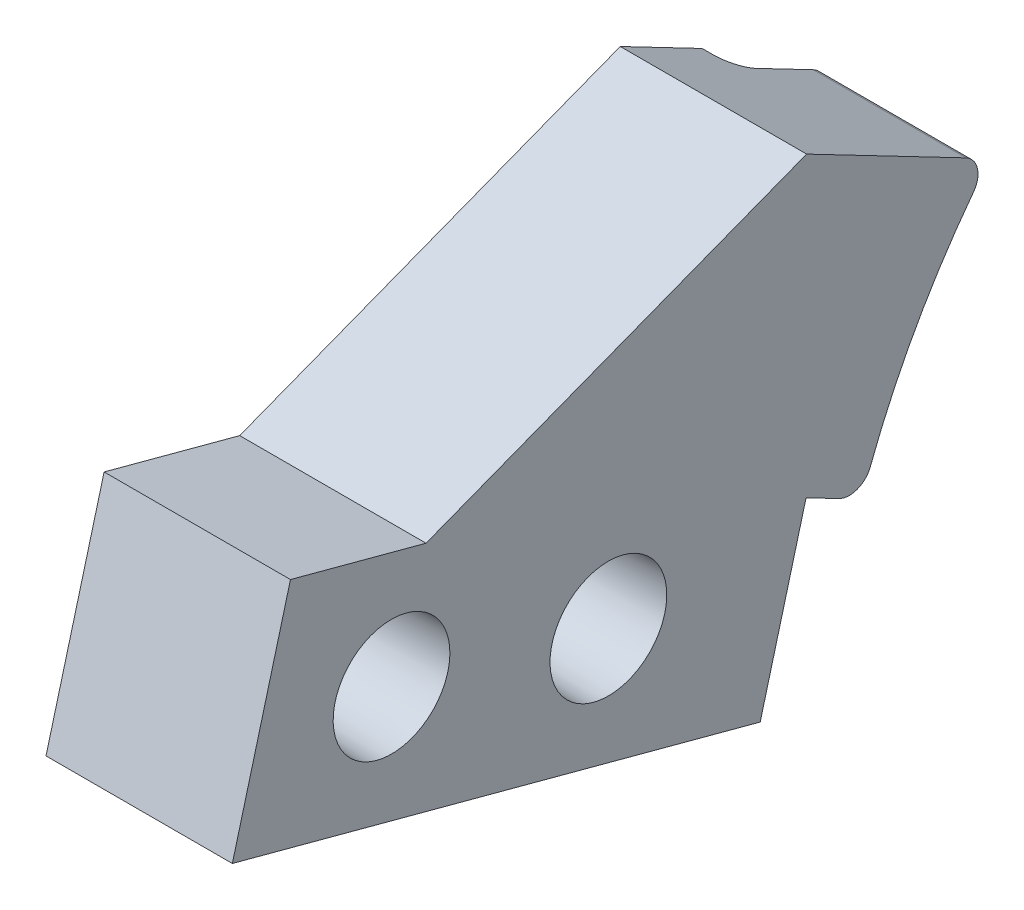
ISO-10303-21;
HEADER;
FILE_DESCRIPTION(('STEP AP214'),'2;1');
FILE_NAME('part.step','',(''),(''),'','','');
FILE_SCHEMA(('AUTOMOTIVE_DESIGN { 1 0 10303 214 1 1 1 1 }'));
ENDSEC;
DATA;
#1=APPLICATION_CONTEXT('core data for automotive mechanical design processes');
#2=APPLICATION_PROTOCOL_DEFINITION('international standard','automotive_design',2000,#1);
#3=PRODUCT_CONTEXT('',#1,'mechanical');
#4=PRODUCT('Part','Part','',(#3));
#5=PRODUCT_RELATED_PRODUCT_CATEGORY('part','',(#4));
#6=PRODUCT_DEFINITION_FORMATION('','',#4);
#7=PRODUCT_DEFINITION_CONTEXT('part definition',#1,'design');
#8=PRODUCT_DEFINITION('design','',#6,#7);
#9=PRODUCT_DEFINITION_SHAPE('','',#8);
#10=(LENGTH_UNIT() NAMED_UNIT(*) SI_UNIT(.MILLI.,.METRE.));
#11=(NAMED_UNIT(*) PLANE_ANGLE_UNIT() SI_UNIT($,.RADIAN.));
#12=(NAMED_UNIT(*) SI_UNIT($,.STERADIAN.) SOLID_ANGLE_UNIT());
#13=UNCERTAINTY_MEASURE_WITH_UNIT(LENGTH_MEASURE(1.E-05),#10,'distance_accuracy_value','');
#14=(GEOMETRIC_REPRESENTATION_CONTEXT(3) GLOBAL_UNCERTAINTY_ASSIGNED_CONTEXT((#13)) GLOBAL_UNIT_ASSIGNED_CONTEXT((#10,
#11,#12)) REPRESENTATION_CONTEXT('',''));
#15=CARTESIAN_POINT('',(0.,0.,0.));
#16=DIRECTION('',(0.,0.,1.));
#17=DIRECTION('',(1.,0.,0.));
#18=AXIS2_PLACEMENT_3D('',#15,#16,#17);
#19=CARTESIAN_POINT('',(22.530729083298,71.5143055066949,42.9719731648555));
#20=DIRECTION('',(-1.,0.,0.));
#21=DIRECTION('',(0.,-1.,0.));
#22=AXIS2_PLACEMENT_3D('',#19,#20,#21);
#23=CYLINDRICAL_SURFACE('',#22,1.7);
#24=CARTESIAN_POINT('',(-13.45,71.5143055066949,42.9719731648555));
#25=DIRECTION('',(1.,0.,0.));
#26=DIRECTION('',(0.,1.,0.));
#27=AXIS2_PLACEMENT_3D('',#24,#25,#26);
#28=CIRCLE('',#27,1.7);
#29=CARTESIAN_POINT('',(-13.45,69.8143055066949,42.9719731648555));
#30=VERTEX_POINT('',#29);
#31=EDGE_CURVE('E334',#30,#30,#28,.T.);
#32=CARTESIAN_POINT('',(-9.05,71.5143055066949,42.9719731648555));
#33=DIRECTION('',(1.,0.,0.));
#34=DIRECTION('',(0.,1.,0.));
#35=AXIS2_PLACEMENT_3D('',#32,#33,#34);
#36=CIRCLE('',#35,1.7);
#37=CARTESIAN_POINT('',(-9.05000000000001,69.8143055066949,42.9719731648555));
#38=VERTEX_POINT('',#37);
#39=EDGE_CURVE('E122',#38,#38,#36,.T.);
#40=CARTESIAN_POINT('',(-13.45,69.8143055066949,42.9719731648555));
#41=CARTESIAN_POINT('',(-13.4041666666667,69.8143055066949,42.9719731648555));
#42=CARTESIAN_POINT('',(-13.3583333333333,69.8143055066949,42.9719731648555));
#43=CARTESIAN_POINT('',(-13.2666666666667,69.8143055066949,42.9719731648555));
#44=CARTESIAN_POINT('',(-13.2208333333333,69.8143055066949,42.9719731648555));
#45=CARTESIAN_POINT('',(-13.1291666666667,69.8143055066949,42.9719731648555));
#46=CARTESIAN_POINT('',(-13.0833333333333,69.8143055066949,42.9719731648555));
#47=CARTESIAN_POINT('',(-12.9916666666667,69.8143055066949,42.9719731648555));
#48=CARTESIAN_POINT('',(-12.9458333333333,69.8143055066949,42.9719731648555));
#49=CARTESIAN_POINT('',(-12.8541666666667,69.8143055066949,42.9719731648555));
#50=CARTESIAN_POINT('',(-12.8083333333333,69.8143055066949,42.9719731648555));
#51=CARTESIAN_POINT('',(-12.7166666666667,69.8143055066949,42.9719731648555));
#52=CARTESIAN_POINT('',(-12.6708333333333,69.8143055066949,42.9719731648555));
#53=CARTESIAN_POINT('',(-12.5791666666667,69.8143055066949,42.9719731648555));
#54=CARTESIAN_POINT('',(-12.5333333333333,69.8143055066949,42.9719731648555));
#55=CARTESIAN_POINT('',(-12.4416666666667,69.8143055066949,42.9719731648555));
#56=CARTESIAN_POINT('',(-12.3958333333333,69.8143055066949,42.9719731648555));
#57=CARTESIAN_POINT('',(-12.3041666666667,69.8143055066949,42.9719731648555));
#58=CARTESIAN_POINT('',(-12.2583333333333,69.8143055066949,42.9719731648555));
#59=CARTESIAN_POINT('',(-12.1666666666667,69.8143055066949,42.9719731648555));
#60=CARTESIAN_POINT('',(-12.1208333333333,69.8143055066949,42.9719731648555));
#61=CARTESIAN_POINT('',(-12.0291666666667,69.8143055066949,42.9719731648555));
#62=CARTESIAN_POINT('',(-11.9833333333333,69.8143055066949,42.9719731648555));
#63=CARTESIAN_POINT('',(-11.8916666666667,69.8143055066949,42.9719731648555));
#64=CARTESIAN_POINT('',(-11.8458333333333,69.8143055066949,42.9719731648555));
#65=CARTESIAN_POINT('',(-11.7541666666667,69.8143055066949,42.9719731648555));
#66=CARTESIAN_POINT('',(-11.7083333333333,69.8143055066949,42.9719731648555));
#67=CARTESIAN_POINT('',(-11.6166666666667,69.8143055066949,42.9719731648555));
#68=CARTESIAN_POINT('',(-11.5708333333333,69.8143055066949,42.9719731648555));
#69=CARTESIAN_POINT('',(-11.4791666666667,69.8143055066949,42.9719731648555));
#70=CARTESIAN_POINT('',(-11.4333333333333,69.8143055066949,42.9719731648555));
#71=CARTESIAN_POINT('',(-11.3416666666667,69.8143055066949,42.9719731648555));
#72=CARTESIAN_POINT('',(-11.2958333333333,69.8143055066949,42.9719731648555));
#73=CARTESIAN_POINT('',(-11.2041666666667,69.8143055066949,42.9719731648555));
#74=CARTESIAN_POINT('',(-11.1583333333333,69.8143055066949,42.9719731648555));
#75=CARTESIAN_POINT('',(-11.0666666666667,69.8143055066949,42.9719731648555));
#76=CARTESIAN_POINT('',(-11.0208333333333,69.8143055066949,42.9719731648555));
#77=CARTESIAN_POINT('',(-10.9291666666667,69.8143055066949,42.9719731648555));
#78=CARTESIAN_POINT('',(-10.8833333333333,69.8143055066949,42.9719731648555));
#79=CARTESIAN_POINT('',(-10.7916666666667,69.8143055066949,42.9719731648555));
#80=CARTESIAN_POINT('',(-10.7458333333333,69.8143055066949,42.9719731648555));
#81=CARTESIAN_POINT('',(-10.6541666666667,69.8143055066949,42.9719731648555));
#82=CARTESIAN_POINT('',(-10.6083333333333,69.8143055066949,42.9719731648555));
#83=CARTESIAN_POINT('',(-10.5166666666667,69.8143055066949,42.9719731648555));
#84=CARTESIAN_POINT('',(-10.4708333333333,69.8143055066949,42.9719731648555));
#85=CARTESIAN_POINT('',(-10.3791666666667,69.8143055066949,42.9719731648555));
#86=CARTESIAN_POINT('',(-10.3333333333333,69.8143055066949,42.9719731648555));
#87=CARTESIAN_POINT('',(-10.2416666666667,69.8143055066949,42.9719731648555));
#88=CARTESIAN_POINT('',(-10.1958333333333,69.8143055066949,42.9719731648555));
#89=CARTESIAN_POINT('',(-10.1041666666667,69.8143055066949,42.9719731648555));
#90=CARTESIAN_POINT('',(-10.0583333333333,69.8143055066949,42.9719731648555));
#91=CARTESIAN_POINT('',(-9.96666666666667,69.8143055066949,42.9719731648555));
#92=CARTESIAN_POINT('',(-9.92083333333334,69.8143055066949,42.9719731648555));
#93=CARTESIAN_POINT('',(-9.82916666666667,69.8143055066949,42.9719731648555));
#94=CARTESIAN_POINT('',(-9.78333333333334,69.8143055066949,42.9719731648555));
#95=CARTESIAN_POINT('',(-9.69166666666668,69.8143055066949,42.9719731648555));
#96=CARTESIAN_POINT('',(-9.64583333333334,69.8143055066949,42.9719731648555));
#97=CARTESIAN_POINT('',(-9.55416666666667,69.8143055066949,42.9719731648555));
#98=CARTESIAN_POINT('',(-9.50833333333334,69.8143055066949,42.9719731648555));
#99=CARTESIAN_POINT('',(-9.41666666666667,69.8143055066949,42.9719731648555));
#100=CARTESIAN_POINT('',(-9.37083333333334,69.8143055066949,42.9719731648555));
#101=CARTESIAN_POINT('',(-9.27916666666667,69.8143055066949,42.9719731648555));
#102=CARTESIAN_POINT('',(-9.23333333333334,69.8143055066949,42.9719731648555));
#103=CARTESIAN_POINT('',(-9.14166666666667,69.8143055066949,42.9719731648555));
#104=CARTESIAN_POINT('',(-9.09583333333334,69.8143055066949,42.9719731648555));
#105=CARTESIAN_POINT('',(-9.05000000000001,69.8143055066949,42.9719731648555));
#106=B_SPLINE_CURVE_WITH_KNOTS('',3,(#40,#41,#42,#43,#44,#45,#46,#47,#48,#49,#50,#51,#52,#53,
#54,#55,#56,#57,#58,#59,#60,#61,#62,#63,#64,#65,#66,#67,#68,#69,#70,#71,#72,#73,#74,#75,#76,#77,
#78,#79,#80,#81,#82,#83,#84,#85,#86,#87,#88,#89,#90,#91,#92,#93,#94,#95,#96,#97,#98,#99,#100,
#101,#102,#103,#104,#105),.UNSPECIFIED.,.F.,.F.,(4,2,2,2,2,2,2,2,2,2,2,2,2,2,2,2,2,2,2,2,2,2,2,
2,2,2,2,2,2,2,2,2,4),(0.,0.137499999999999,0.274999999999997,0.412499999999996,
0.549999999999995,0.687500000000001,0.824999999999999,0.962499999999998,1.1,1.2375,
1.37499999999999,1.51249999999999,1.65,1.7875,1.925,2.06249999999999,2.19999999999999,
2.33749999999999,2.47499999999999,2.61249999999999,2.74999999999999,2.88749999999999,
3.02499999999999,3.16249999999999,3.29999999999999,3.43749999999999,3.57499999999999,
3.71249999999999,3.84999999999999,3.98749999999999,4.12499999999999,4.26249999999999,
4.39999999999999),.UNSPECIFIED.);
#107=EDGE_CURVE('BSEAM117',#30,#38,#106,.T.);
#108=ORIENTED_EDGE('',*,*,#31,.F.);
#109=ORIENTED_EDGE('',*,*,#39,.T.);
#110=ORIENTED_EDGE('',*,*,#107,.T.);
#111=ORIENTED_EDGE('',*,*,#107,.F.);
#112=EDGE_LOOP('',(#108,#110,#109,#111));
#113=FACE_BOUND('',#112,.T.);
#114=ADVANCED_FACE('F117',(#113),#23,.F.);
#115=CARTESIAN_POINT('',(22.530729083298,74.1024959577201,52.6312314277462));
#116=DIRECTION('',(-1.,0.,0.));
#117=DIRECTION('',(0.,-1.,0.));
#118=AXIS2_PLACEMENT_3D('',#115,#116,#117);
#119=CYLINDRICAL_SURFACE('',#118,1.70000000000049);
#120=CARTESIAN_POINT('',(-13.45,74.1024959577201,52.6312314277462));
#121=DIRECTION('',(1.,0.,0.));
#122=DIRECTION('',(0.,1.,0.));
#123=AXIS2_PLACEMENT_3D('',#120,#121,#122);
#124=CIRCLE('',#123,1.70000000000049);
#125=CARTESIAN_POINT('',(-13.45,72.4024959577197,52.6312314277462));
#126=VERTEX_POINT('',#125);
#127=EDGE_CURVE('E310',#126,#126,#124,.T.);
#128=CARTESIAN_POINT('',(-9.05,74.1024959577201,52.6312314277462));
#129=DIRECTION('',(1.,0.,0.));
#130=DIRECTION('',(0.,1.,0.));
#131=AXIS2_PLACEMENT_3D('',#128,#129,#130);
#132=CIRCLE('',#131,1.70000000000049);
#133=CARTESIAN_POINT('',(-9.05000000000001,72.4024959577197,52.6312314277462));
#134=VERTEX_POINT('',#133);
#135=EDGE_CURVE('E450',#134,#134,#132,.T.);
#136=CARTESIAN_POINT('',(-13.45,72.4024959577197,52.6312314277462));
#137=CARTESIAN_POINT('',(-13.4041666666667,72.4024959577197,52.6312314277462));
#138=CARTESIAN_POINT('',(-13.3583333333333,72.4024959577197,52.6312314277462));
#139=CARTESIAN_POINT('',(-13.2666666666667,72.4024959577197,52.6312314277462));
#140=CARTESIAN_POINT('',(-13.2208333333333,72.4024959577197,52.6312314277462));
#141=CARTESIAN_POINT('',(-13.1291666666667,72.4024959577197,52.6312314277462));
#142=CARTESIAN_POINT('',(-13.0833333333333,72.4024959577197,52.6312314277462));
#143=CARTESIAN_POINT('',(-12.9916666666667,72.4024959577197,52.6312314277462));
#144=CARTESIAN_POINT('',(-12.9458333333333,72.4024959577197,52.6312314277462));
#145=CARTESIAN_POINT('',(-12.8541666666667,72.4024959577197,52.6312314277462));
#146=CARTESIAN_POINT('',(-12.8083333333333,72.4024959577197,52.6312314277462));
#147=CARTESIAN_POINT('',(-12.7166666666667,72.4024959577197,52.6312314277462));
#148=CARTESIAN_POINT('',(-12.6708333333333,72.4024959577197,52.6312314277462));
#149=CARTESIAN_POINT('',(-12.5791666666667,72.4024959577197,52.6312314277462));
#150=CARTESIAN_POINT('',(-12.5333333333333,72.4024959577197,52.6312314277462));
#151=CARTESIAN_POINT('',(-12.4416666666667,72.4024959577197,52.6312314277462));
#152=CARTESIAN_POINT('',(-12.3958333333333,72.4024959577197,52.6312314277462));
#153=CARTESIAN_POINT('',(-12.3041666666667,72.4024959577197,52.6312314277462));
#154=CARTESIAN_POINT('',(-12.2583333333333,72.4024959577197,52.6312314277462));
#155=CARTESIAN_POINT('',(-12.1666666666667,72.4024959577197,52.6312314277462));
#156=CARTESIAN_POINT('',(-12.1208333333333,72.4024959577197,52.6312314277462));
#157=CARTESIAN_POINT('',(-12.0291666666667,72.4024959577197,52.6312314277462));
#158=CARTESIAN_POINT('',(-11.9833333333333,72.4024959577197,52.6312314277462));
#159=CARTESIAN_POINT('',(-11.8916666666667,72.4024959577197,52.6312314277462));
#160=CARTESIAN_POINT('',(-11.8458333333333,72.4024959577197,52.6312314277462));
#161=CARTESIAN_POINT('',(-11.7541666666667,72.4024959577197,52.6312314277462));
#162=CARTESIAN_POINT('',(-11.7083333333333,72.4024959577197,52.6312314277462));
#163=CARTESIAN_POINT('',(-11.6166666666667,72.4024959577197,52.6312314277462));
#164=CARTESIAN_POINT('',(-11.5708333333333,72.4024959577197,52.6312314277462));
#165=CARTESIAN_POINT('',(-11.4791666666667,72.4024959577197,52.6312314277462));
#166=CARTESIAN_POINT('',(-11.4333333333333,72.4024959577197,52.6312314277462));
#167=CARTESIAN_POINT('',(-11.3416666666667,72.4024959577197,52.6312314277462));
#168=CARTESIAN_POINT('',(-11.2958333333333,72.4024959577197,52.6312314277462));
#169=CARTESIAN_POINT('',(-11.2041666666667,72.4024959577197,52.6312314277462));
#170=CARTESIAN_POINT('',(-11.1583333333333,72.4024959577197,52.6312314277462));
#171=CARTESIAN_POINT('',(-11.0666666666667,72.4024959577197,52.6312314277462));
#172=CARTESIAN_POINT('',(-11.0208333333333,72.4024959577197,52.6312314277462));
#173=CARTESIAN_POINT('',(-10.9291666666667,72.4024959577197,52.6312314277462));
#174=CARTESIAN_POINT('',(-10.8833333333333,72.4024959577197,52.6312314277462));
#175=CARTESIAN_POINT('',(-10.7916666666667,72.4024959577197,52.6312314277462));
#176=CARTESIAN_POINT('',(-10.7458333333333,72.4024959577197,52.6312314277462));
#177=CARTESIAN_POINT('',(-10.6541666666667,72.4024959577197,52.6312314277462));
#178=CARTESIAN_POINT('',(-10.6083333333333,72.4024959577197,52.6312314277462));
#179=CARTESIAN_POINT('',(-10.5166666666667,72.4024959577197,52.6312314277462));
#180=CARTESIAN_POINT('',(-10.4708333333333,72.4024959577197,52.6312314277462));
#181=CARTESIAN_POINT('',(-10.3791666666667,72.4024959577197,52.6312314277462));
#182=CARTESIAN_POINT('',(-10.3333333333333,72.4024959577197,52.6312314277462));
#183=CARTESIAN_POINT('',(-10.2416666666667,72.4024959577197,52.6312314277462));
#184=CARTESIAN_POINT('',(-10.1958333333333,72.4024959577197,52.6312314277462));
#185=CARTESIAN_POINT('',(-10.1041666666667,72.4024959577197,52.6312314277462));
#186=CARTESIAN_POINT('',(-10.0583333333333,72.4024959577197,52.6312314277462));
#187=CARTESIAN_POINT('',(-9.96666666666667,72.4024959577197,52.6312314277462));
#188=CARTESIAN_POINT('',(-9.92083333333334,72.4024959577197,52.6312314277462));
#189=CARTESIAN_POINT('',(-9.82916666666667,72.4024959577197,52.6312314277462));
#190=CARTESIAN_POINT('',(-9.78333333333334,72.4024959577197,52.6312314277462));
#191=CARTESIAN_POINT('',(-9.69166666666668,72.4024959577197,52.6312314277462));
#192=CARTESIAN_POINT('',(-9.64583333333334,72.4024959577197,52.6312314277462));
#193=CARTESIAN_POINT('',(-9.55416666666667,72.4024959577197,52.6312314277462));
#194=CARTESIAN_POINT('',(-9.50833333333334,72.4024959577197,52.6312314277462));
#195=CARTESIAN_POINT('',(-9.41666666666667,72.4024959577197,52.6312314277462));
#196=CARTESIAN_POINT('',(-9.37083333333334,72.4024959577197,52.6312314277462));
#197=CARTESIAN_POINT('',(-9.27916666666667,72.4024959577197,52.6312314277462));
#198=CARTESIAN_POINT('',(-9.23333333333334,72.4024959577197,52.6312314277462));
#199=CARTESIAN_POINT('',(-9.14166666666667,72.4024959577197,52.6312314277462));
#200=CARTESIAN_POINT('',(-9.09583333333334,72.4024959577197,52.6312314277462));
#201=CARTESIAN_POINT('',(-9.05000000000001,72.4024959577197,52.6312314277462));
#202=B_SPLINE_CURVE_WITH_KNOTS('',3,(#136,#137,#138,#139,#140,#141,#142,#143,#144,#145,#146,
#147,#148,#149,#150,#151,#152,#153,#154,#155,#156,#157,#158,#159,#160,#161,#162,#163,#164,#165,
#166,#167,#168,#169,#170,#171,#172,#173,#174,#175,#176,#177,#178,#179,#180,#181,#182,#183,#184,
#185,#186,#187,#188,#189,#190,#191,#192,#193,#194,#195,#196,#197,#198,#199,#200,#201),
.UNSPECIFIED.,.F.,.F.,(4,2,2,2,2,2,2,2,2,2,2,2,2,2,2,2,2,2,2,2,2,2,2,2,2,2,2,2,2,2,2,2,4),(0.,
0.137499999999999,0.274999999999997,0.412499999999996,0.549999999999995,0.687500000000001,
0.824999999999999,0.962499999999998,1.1,1.2375,1.37499999999999,1.51249999999999,1.65,1.7875,
1.925,2.06249999999999,2.19999999999999,2.33749999999999,2.47499999999999,2.61249999999999,
2.74999999999999,2.88749999999999,3.02499999999999,3.16249999999999,3.29999999999999,
3.43749999999999,3.57499999999999,3.71249999999999,3.84999999999999,3.98749999999999,
4.12499999999999,4.26249999999999,4.39999999999999),.UNSPECIFIED.);
#203=EDGE_CURVE('BSEAM366',#126,#134,#202,.T.);
#204=ORIENTED_EDGE('',*,*,#127,.F.);
#205=ORIENTED_EDGE('',*,*,#135,.T.);
#206=ORIENTED_EDGE('',*,*,#203,.T.);
#207=ORIENTED_EDGE('',*,*,#203,.F.);
#208=EDGE_LOOP('',(#204,#206,#205,#207));
#209=FACE_BOUND('',#208,.T.);
#210=ADVANCED_FACE('F366',(#209),#119,.F.);
#211=CARTESIAN_POINT('',(22.530729083298,60.,0.));
#212=DIRECTION('',(-1.,0.,0.));
#213=DIRECTION('',(0.,-1.,0.));
#214=AXIS2_PLACEMENT_3D('',#211,#212,#213);
#215=CYLINDRICAL_SURFACE('',#214,38.5);
#216=DIRECTION('',(-1.,0.,0.));
#217=VECTOR('',#216,1.);
#218=CARTESIAN_POINT('',(22.530729083298,83.5019134389998,30.4944267810654));
#219=LINE('',#218,#217);
#220=CARTESIAN_POINT('',(-12.95,83.5019134389998,30.4944267810654));
#221=VERTEX_POINT('',#220);
#222=CARTESIAN_POINT('',(-13.45,83.5019134389998,30.4944267810654));
#223=VERTEX_POINT('',#222);
#224=EDGE_CURVE('E329',#221,#223,#219,.T.);
#225=ORIENTED_EDGE('',*,*,#224,.F.);
#226=CARTESIAN_POINT('',(-12.95,60.,0.));
#227=DIRECTION('',(1.,0.,0.));
#228=DIRECTION('',(0.,1.,0.));
#229=AXIS2_PLACEMENT_3D('',#226,#227,#228);
#230=CIRCLE('',#229,38.5);
#231=CARTESIAN_POINT('',(-12.95,70.9707208423274,36.9038383396595));
#232=VERTEX_POINT('',#231);
#233=EDGE_CURVE('E333',#221,#232,#230,.T.);
#234=ORIENTED_EDGE('',*,*,#233,.T.);
#235=DIRECTION('',(-1.,0.,0.));
#236=VECTOR('',#235,1.);
#237=CARTESIAN_POINT('',(22.530729083298,70.9707208423274,36.9038383396595));
#238=LINE('',#237,#236);
#239=CARTESIAN_POINT('',(-13.45,70.9707208423274,36.9038383396595));
#240=VERTEX_POINT('',#239);
#241=EDGE_CURVE('E301',#232,#240,#238,.T.);
#242=ORIENTED_EDGE('',*,*,#241,.T.);
#243=CARTESIAN_POINT('',(-13.45,60.,0.));
#244=DIRECTION('',(1.,0.,0.));
#245=DIRECTION('',(0.,1.,0.));
#246=AXIS2_PLACEMENT_3D('',#243,#244,#245);
#247=CIRCLE('',#246,38.5);
#248=EDGE_CURVE('E330',#223,#240,#247,.T.);
#249=ORIENTED_EDGE('',*,*,#248,.F.);
#250=EDGE_LOOP('',(#225,#234,#242,#249));
#251=FACE_BOUND('',#250,.T.);
#252=ADVANCED_FACE('F384',(#251),#215,.F.);
#253=CARTESIAN_POINT('',(22.530729083298,53.2085356708744,-27.6986104779532));
#254=DIRECTION('',(0.,-0.88701083318103,0.46174861322964));
#255=DIRECTION('',(0.,-0.46174861322964,-0.88701083318103));
#256=AXIS2_PLACEMENT_3D('',#253,#254,#255);
#257=PLANE('',#256);
#258=DIRECTION('',(-1.,0.,0.));
#259=VECTOR('',#258,1.);
#260=CARTESIAN_POINT('',(22.530729083298,85.401338782543,34.1431889175822));
#261=LINE('',#260,#259);
#262=CARTESIAN_POINT('',(-5.15,85.401338782543,34.1431889175822));
#263=VERTEX_POINT('',#262);
#264=CARTESIAN_POINT('',(-13.45,85.401338782543,34.1431889175822));
#265=VERTEX_POINT('',#264);
#266=EDGE_CURVE('E238',#263,#265,#261,.T.);
#267=ORIENTED_EDGE('',*,*,#266,.F.);
#268=DIRECTION('',(0.,0.461748613229638,0.887010833181031));
#269=VECTOR('',#268,1.);
#270=CARTESIAN_POINT('',(-5.15,81.7075304662784,27.0474491614749));
#271=LINE('',#270,#269);
#272=CARTESIAN_POINT('',(-5.15,81.7075304662784,27.0474491614749));
#273=VERTEX_POINT('',#272);
#274=EDGE_CURVE('E235',#273,#263,#271,.T.);
#275=ORIENTED_EDGE('',*,*,#274,.F.);
#276=DIRECTION('',(-1.,0.,0.));
#277=VECTOR('',#276,1.);
#278=CARTESIAN_POINT('',(-10.45,81.7075304662784,27.0474491614749));
#279=LINE('',#278,#277);
#280=CARTESIAN_POINT('',(-11.95,81.7075304662784,27.0474491614749));
#281=VERTEX_POINT('',#280);
#282=EDGE_CURVE('E223',#273,#281,#279,.T.);
#283=ORIENTED_EDGE('',*,*,#282,.T.);
#284=DIRECTION('',(0.,-0.461748613229638,-0.887010833181031));
#285=VECTOR('',#284,1.);
#286=CARTESIAN_POINT('',(-11.95,53.2085356708746,-27.6986104779532));
#287=LINE('',#286,#285);
#288=CARTESIAN_POINT('',(-11.95,83.0326660406718,29.5930109157362));
#289=VERTEX_POINT('',#288);
#290=EDGE_CURVE('E284',#289,#281,#287,.T.);
#291=ORIENTED_EDGE('',*,*,#290,.F.);
#292=CARTESIAN_POINT('',(-11.95,83.0326660406718,29.5930109157362));
#293=CARTESIAN_POINT('',(-11.9499552566562,83.0593848996614,29.6443373663091));
#294=CARTESIAN_POINT('',(-11.9548564786664,83.0861000162211,29.6956566277408));
#295=CARTESIAN_POINT('',(-11.9742327569263,83.1387721466214,29.7968388488309));
#296=CARTESIAN_POINT('',(-11.9887050849698,83.1647293742945,29.8467022192573));
#297=CARTESIAN_POINT('',(-12.0269184521624,83.2151678634915,29.9435936555176));
#298=CARTESIAN_POINT('',(-12.0506656180974,83.2396481370006,29.9906198233927));
#299=CARTESIAN_POINT('',(-12.1067839721958,83.286393368931,30.0804165784535));
#300=CARTESIAN_POINT('',(-12.1391523969611,83.3086590340721,30.1231885232353));
#301=CARTESIAN_POINT('',(-12.2113528976497,83.3501497435903,30.2028914346562));
#302=CARTESIAN_POINT('',(-12.2511234914906,83.3693975874231,30.2398661986424));
#303=CARTESIAN_POINT('',(-12.3372067876694,83.4044826320622,30.3072639423191));
#304=CARTESIAN_POINT('',(-12.3835205515858,83.4203192783736,30.3376858568348));
#305=CARTESIAN_POINT('',(-12.4806066170441,83.4478688197836,30.3906080334906));
#306=CARTESIAN_POINT('',(-12.5313005653012,83.459640664455,30.413221536706));
#307=CARTESIAN_POINT('',(-12.636276371452,83.4790163459158,30.4504418744907));
#308=CARTESIAN_POINT('',(-12.6905552688756,83.4866235748096,30.4650552252318));
#309=CARTESIAN_POINT('',(-12.7793711321999,83.4953155916702,30.4817524342686));
#310=CARTESIAN_POINT('',(-12.8132994614273,83.4977883839691,30.4865026240784));
#311=CARTESIAN_POINT('',(-12.8814799297402,83.5010868680839,30.4928389531092));
#312=CARTESIAN_POINT('',(-12.9157315306552,83.5019149325503,30.4944296501491));
#313=CARTESIAN_POINT('',(-12.95,83.5019134389998,30.4944267810654));
#314=B_SPLINE_CURVE_WITH_KNOTS('',3,(#292,#293,#294,#295,#296,#297,#298,#299,#300,#301,#302,
#303,#304,#305,#306,#307,#308,#309,#310,#311,#312,#313),.UNSPECIFIED.,.F.,.F.,(4,2,2,2,2,2,2,2,
2,2,4),(0.,0.173375826272796,0.346702253735689,0.520143371603605,0.693528962629543,
0.86553395879368,1.03756689354531,1.20698835391435,1.37627161340756,1.4791456975858,
1.58187126963852),.UNSPECIFIED.);
#315=EDGE_CURVE('E12',#289,#221,#314,.T.);
#316=ORIENTED_EDGE('',*,*,#315,.T.);
#317=ORIENTED_EDGE('',*,*,#224,.T.);
#318=DIRECTION('',(0.,0.46174861322964,0.88701083318103));
#319=VECTOR('',#318,1.);
#320=CARTESIAN_POINT('',(-13.45,53.2085356708744,-27.6986104779532));
#321=LINE('',#320,#319);
#322=EDGE_CURVE('E327',#223,#265,#321,.T.);
#323=ORIENTED_EDGE('',*,*,#322,.T.);
#324=EDGE_LOOP('',(#267,#275,#283,#291,#316,#317,#323));
#325=FACE_BOUND('',#324,.T.);
#326=ADVANCED_FACE('F236',(#325),#257,.F.);
#327=CARTESIAN_POINT('',(22.530729083298,85.8115603470169,33.0790172629132));
#328=DIRECTION('',(0.,-0.933073662722769,-0.359685334609455));
#329=DIRECTION('',(0.,0.359685334609455,-0.93307366272277));
#330=AXIS2_PLACEMENT_3D('',#327,#328,#329);
#331=PLANE('',#330);
#332=DIRECTION('',(-1.,0.,0.));
#333=VECTOR('',#332,1.);
#334=CARTESIAN_POINT('',(22.530729083298,78.8670133207233,51.0941357742366));
#335=LINE('',#334,#333);
#336=CARTESIAN_POINT('',(-5.15,78.8670133207233,51.0941357742366));
#337=VERTEX_POINT('',#336);
#338=CARTESIAN_POINT('',(-13.45,78.8670133207233,51.0941357742366));
#339=VERTEX_POINT('',#338);
#340=EDGE_CURVE('E323',#337,#339,#335,.T.);
#341=ORIENTED_EDGE('',*,*,#340,.F.);
#342=DIRECTION('',(0.,-0.359685334609455,0.933073662722769));
#343=VECTOR('',#342,1.);
#344=CARTESIAN_POINT('',(-5.15,85.401338782543,34.1431889175822));
#345=LINE('',#344,#343);
#346=EDGE_CURVE('E242',#263,#337,#345,.T.);
#347=ORIENTED_EDGE('',*,*,#346,.F.);
#348=ORIENTED_EDGE('',*,*,#266,.T.);
#349=DIRECTION('',(0.,-0.359685334609455,0.933073662722769));
#350=VECTOR('',#349,1.);
#351=CARTESIAN_POINT('',(-13.45,85.8115603470169,33.0790172629132));
#352=LINE('',#351,#350);
#353=EDGE_CURVE('E324',#265,#339,#352,.T.);
#354=ORIENTED_EDGE('',*,*,#353,.T.);
#355=EDGE_LOOP('',(#341,#347,#348,#354));
#356=FACE_BOUND('',#355,.T.);
#357=ADVANCED_FACE('F378',(#356),#331,.F.);
#358=CARTESIAN_POINT('',(22.530729083298,60.8103912449785,-16.2940952255126));
#359=DIRECTION('',(0.,-0.965925826289068,0.258819045102521));
#360=DIRECTION('',(0.,-0.258819045102521,-0.965925826289068));
#361=AXIS2_PLACEMENT_3D('',#358,#359,#360);
#362=PLANE('',#361);
#363=DIRECTION('',(-1.,0.,0.));
#364=VECTOR('',#363,1.);
#365=CARTESIAN_POINT('',(22.530729083298,80.4850393597874,57.1326911599934));
#366=LINE('',#365,#364);
#367=CARTESIAN_POINT('',(-5.15,80.4850393597874,57.1326911599934));
#368=VERTEX_POINT('',#367);
#369=CARTESIAN_POINT('',(-13.45,80.4850393597874,57.1326911599934));
#370=VERTEX_POINT('',#369);
#371=EDGE_CURVE('E319',#368,#370,#366,.T.);
#372=ORIENTED_EDGE('',*,*,#371,.F.);
#373=DIRECTION('',(0.,0.25881904510252,0.965925826289068));
#374=VECTOR('',#373,1.);
#375=CARTESIAN_POINT('',(-5.15,78.8670133207233,51.0941357742366));
#376=LINE('',#375,#374);
#377=EDGE_CURVE('E259',#337,#368,#376,.T.);
#378=ORIENTED_EDGE('',*,*,#377,.F.);
#379=ORIENTED_EDGE('',*,*,#340,.T.);
#380=DIRECTION('',(0.,0.258819045102521,0.965925826289068));
#381=VECTOR('',#380,1.);
#382=CARTESIAN_POINT('',(-13.45,60.8103912449785,-16.2940952255126));
#383=LINE('',#382,#381);
#384=EDGE_CURVE('E320',#339,#370,#383,.T.);
#385=ORIENTED_EDGE('',*,*,#384,.T.);
#386=EDGE_LOOP('',(#372,#378,#379,#385));
#387=FACE_BOUND('',#386,.T.);
#388=ADVANCED_FACE('F374',(#387),#362,.F.);
#389=CARTESIAN_POINT('',(22.530729083298,19.6746481148089,73.426786385506));
#390=DIRECTION('',(0.,-0.258819045102521,-0.965925826289068));
#391=DIRECTION('',(0.,0.965925826289068,-0.258819045102521));
#392=AXIS2_PLACEMENT_3D('',#389,#390,#391);
#393=PLANE('',#392);
#394=DIRECTION('',(-1.,0.,0.));
#395=VECTOR('',#394,1.);
#396=CARTESIAN_POINT('',(22.530729083298,70.8257810968967,59.7208816110186));
#397=LINE('',#396,#395);
#398=CARTESIAN_POINT('',(-5.15,70.8257810968967,59.7208816110186));
#399=VERTEX_POINT('',#398);
#400=CARTESIAN_POINT('',(-13.45,70.8257810968967,59.7208816110186));
#401=VERTEX_POINT('',#400);
#402=EDGE_CURVE('E315',#399,#401,#397,.T.);
#403=ORIENTED_EDGE('',*,*,#402,.F.);
#404=DIRECTION('',(0.,-0.965925826289068,0.258819045102521));
#405=VECTOR('',#404,1.);
#406=CARTESIAN_POINT('',(-5.15,80.4850393597874,57.1326911599934));
#407=LINE('',#406,#405);
#408=EDGE_CURVE('E262',#368,#399,#407,.T.);
#409=ORIENTED_EDGE('',*,*,#408,.F.);
#410=ORIENTED_EDGE('',*,*,#371,.T.);
#411=DIRECTION('',(0.,-0.965925826289068,0.258819045102521));
#412=VECTOR('',#411,1.);
#413=CARTESIAN_POINT('',(-13.45,19.6746481148089,73.426786385506));
#414=LINE('',#413,#412);
#415=EDGE_CURVE('E316',#370,#401,#414,.T.);
#416=ORIENTED_EDGE('',*,*,#415,.T.);
#417=EDGE_LOOP('',(#403,#409,#410,#416));
#418=FACE_BOUND('',#417,.T.);
#419=ADVANCED_FACE('F370',(#418),#393,.F.);
#420=CARTESIAN_POINT('',(22.530729083298,51.1511329820878,-13.7059047744874));
#421=DIRECTION('',(0.,0.965925826289068,-0.258819045102521));
#422=DIRECTION('',(0.,0.258819045102521,0.965925826289068));
#423=AXIS2_PLACEMENT_3D('',#420,#421,#422);
#424=PLANE('',#423);
#425=DIRECTION('',(-1.,0.,0.));
#426=VECTOR('',#425,1.);
#427=CARTESIAN_POINT('',(22.530729083298,67.1055738029502,45.8368789753219));
#428=LINE('',#427,#426);
#429=CARTESIAN_POINT('',(-10.45,67.1055738029502,45.8368789753219));
#430=VERTEX_POINT('',#429);
#431=CARTESIAN_POINT('',(-13.45,67.1055738029502,45.8368789753219));
#432=VERTEX_POINT('',#431);
#433=EDGE_CURVE('E311',#430,#432,#428,.T.);
#434=ORIENTED_EDGE('',*,*,#433,.F.);
#435=DIRECTION('',(0.,-0.258819045102521,-0.965925826289068));
#436=VECTOR('',#435,1.);
#437=CARTESIAN_POINT('',(-10.45,64.5263251979903,36.2109921362602));
#438=LINE('',#437,#436);
#439=CARTESIAN_POINT('',(-10.45,64.5263251979903,36.2109921362602));
#440=VERTEX_POINT('',#439);
#441=EDGE_CURVE('E252',#430,#440,#438,.T.);
#442=ORIENTED_EDGE('',*,*,#441,.T.);
#443=DIRECTION('',(-1.,0.,0.));
#444=VECTOR('',#443,1.);
#445=CARTESIAN_POINT('',(-5.15,64.5263251979903,36.2109921362602));
#446=LINE('',#445,#444);
#447=CARTESIAN_POINT('',(-5.15,64.5263251979903,36.2109921362602));
#448=VERTEX_POINT('',#447);
#449=EDGE_CURVE('E279',#448,#440,#446,.T.);
#450=ORIENTED_EDGE('',*,*,#449,.F.);
#451=DIRECTION('',(0.,-0.25881904510252,-0.965925826289068));
#452=VECTOR('',#451,1.);
#453=CARTESIAN_POINT('',(-5.15,70.8257810968967,59.7208816110186));
#454=LINE('',#453,#452);
#455=EDGE_CURVE('E265',#399,#448,#454,.T.);
#456=ORIENTED_EDGE('',*,*,#455,.F.);
#457=ORIENTED_EDGE('',*,*,#402,.T.);
#458=DIRECTION('',(0.,-0.258819045102521,-0.965925826289068));
#459=VECTOR('',#458,1.);
#460=CARTESIAN_POINT('',(-13.45,51.1511329820878,-13.7059047744874));
#461=LINE('',#460,#459);
#462=EDGE_CURVE('E312',#401,#432,#461,.T.);
#463=ORIENTED_EDGE('',*,*,#462,.T.);
#464=EDGE_LOOP('',(#434,#442,#450,#456,#457,#463));
#465=FACE_BOUND('',#464,.T.);
#466=ADVANCED_FACE('F365',(#465),#424,.F.);
#467=CARTESIAN_POINT('',(22.530729083298,73.2289412639386,31.6846902490383));
#468=DIRECTION('',(0.,0.91777427803728,0.397102473642699));
#469=DIRECTION('',(0.,-0.397102473642699,0.91777427803728));
#470=AXIS2_PLACEMENT_3D('',#467,#468,#469);
#471=PLANE('',#470);
#472=ORIENTED_EDGE('',*,*,#241,.F.);
#473=CARTESIAN_POINT('',(-12.95,70.9707208423274,36.9038383396595));
#474=CARTESIAN_POINT('',(-12.9265092414128,70.9707195792188,36.9038412589275));
#475=CARTESIAN_POINT('',(-12.9030319056724,70.9711499808366,36.9028465244188));
#476=CARTESIAN_POINT('',(-12.8562868033224,70.9728580321658,36.8988989147221));
#477=CARTESIAN_POINT('',(-12.8330189236209,70.9741351929329,36.8959471695713));
#478=CARTESIAN_POINT('',(-12.7641173602868,70.9791874556621,36.8842704939359));
#479=CARTESIAN_POINT('',(-12.7190197000792,70.984183902947,36.8727228176962));
#480=CARTESIAN_POINT('',(-12.6317315498756,70.9971063200027,36.8428568189401));
#481=CARTESIAN_POINT('',(-12.589535657844,71.0050266612124,36.8245515050275));
#482=CARTESIAN_POINT('',(-12.5087010606793,71.0233755151416,36.7821440477956));
#483=CARTESIAN_POINT('',(-12.4700687936599,71.0338084489995,36.758031686441));
#484=CARTESIAN_POINT('',(-12.3850391577858,71.0604493743214,36.6964597808841));
#485=CARTESIAN_POINT('',(-12.3401835189622,71.077433153266,36.6572072541591));
#486=CARTESIAN_POINT('',(-12.2580442812206,71.1140688440853,36.572535672077));
#487=CARTESIAN_POINT('',(-12.220771913791,71.1337246426593,36.5271076338679));
#488=CARTESIAN_POINT('',(-12.1438648911499,71.1810244576851,36.4177893685136));
#489=CARTESIAN_POINT('',(-12.106764354108,71.2093167701262,36.3524008143037));
#490=CARTESIAN_POINT('',(-12.0445571596801,71.2679246915982,36.2169475084535));
#491=CARTESIAN_POINT('',(-12.0194727960251,71.2982439434299,36.146874337654));
#492=CARTESIAN_POINT('',(-11.9832063424521,71.3560767066086,36.0132125601627));
#493=CARTESIAN_POINT('',(-11.9706660130057,71.3834593179288,35.9499264866597));
#494=CARTESIAN_POINT('',(-11.9541009775422,71.4384634946604,35.8228020743493));
#495=CARTESIAN_POINT('',(-11.9500254592995,71.4660826290319,35.7589693541063));
#496=CARTESIAN_POINT('',(-11.95,71.4936873947777,35.6951698423068));
#497=B_SPLINE_CURVE_WITH_KNOTS('',3,(#473,#474,#475,#476,#477,#478,#479,#480,#481,#482,#483,
#484,#485,#486,#487,#488,#489,#490,#491,#492,#493,#494,#495,#496),.UNSPECIFIED.,.F.,.F.,(4,2,2,
2,2,2,2,2,2,2,2,4),(0.,0.0704215921812293,0.140802556178937,0.280482558131645,0.419895063282911,
0.559554693297546,0.744481525006733,0.929680287040651,1.16939332627352,1.40954940142668,
1.61929367575353,1.8277752233708),.UNSPECIFIED.);
#498=CARTESIAN_POINT('',(-11.95,71.4936873947778,35.6951698423068));
#499=VERTEX_POINT('',#498);
#500=EDGE_CURVE('E127',#232,#499,#497,.T.);
#501=ORIENTED_EDGE('',*,*,#500,.T.);
#502=DIRECTION('',(0.,-0.397102473642701,0.917774278037279));
#503=VECTOR('',#502,1.);
#504=CARTESIAN_POINT('',(-11.95,73.2289412639385,31.6846902490384));
#505=LINE('',#504,#503);
#506=CARTESIAN_POINT('',(-11.95,72.1549335293434,34.1669126945008));
#507=VERTEX_POINT('',#506);
#508=EDGE_CURVE('E295',#507,#499,#505,.T.);
#509=ORIENTED_EDGE('',*,*,#508,.F.);
#510=DIRECTION('',(-1.,0.,0.));
#511=VECTOR('',#510,1.);
#512=CARTESIAN_POINT('',(-10.45,72.1549335293434,34.1669126945008));
#513=LINE('',#512,#511);
#514=CARTESIAN_POINT('',(-10.45,72.1549335293434,34.1669126945008));
#515=VERTEX_POINT('',#514);
#516=EDGE_CURVE('E298',#515,#507,#513,.T.);
#517=ORIENTED_EDGE('',*,*,#516,.F.);
#518=DIRECTION('',(0.,-0.397102473642702,0.917774278037278));
#519=VECTOR('',#518,1.);
#520=CARTESIAN_POINT('',(-10.45,73.2289412639385,31.6846902490385));
#521=LINE('',#520,#519);
#522=EDGE_CURVE('E232',#515,#430,#521,.T.);
#523=ORIENTED_EDGE('',*,*,#522,.T.);
#524=ORIENTED_EDGE('',*,*,#433,.T.);
#525=DIRECTION('',(0.,0.397102473642699,-0.91777427803728));
#526=VECTOR('',#525,1.);
#527=CARTESIAN_POINT('',(-13.45,73.2289412639386,31.6846902490383));
#528=LINE('',#527,#526);
#529=EDGE_CURVE('E307',#432,#240,#528,.T.);
#530=ORIENTED_EDGE('',*,*,#529,.T.);
#531=EDGE_LOOP('',(#472,#501,#509,#517,#523,#524,#530));
#532=FACE_BOUND('',#531,.T.);
#533=ADVANCED_FACE('F359',(#532),#471,.F.);
#534=CARTESIAN_POINT('',(-13.45,0.,0.));
#535=DIRECTION('',(1.,0.,0.));
#536=DIRECTION('',(0.,1.,0.));
#537=AXIS2_PLACEMENT_3D('',#534,#535,#536);
#538=PLANE('',#537);
#539=ORIENTED_EDGE('',*,*,#127,.T.);
#540=EDGE_LOOP('',(#539));
#541=FACE_BOUND('',#540,.T.);
#542=ORIENTED_EDGE('',*,*,#31,.T.);
#543=EDGE_LOOP('',(#542));
#544=FACE_BOUND('',#543,.T.);
#545=ORIENTED_EDGE('',*,*,#248,.T.);
#546=ORIENTED_EDGE('',*,*,#529,.F.);
#547=ORIENTED_EDGE('',*,*,#462,.F.);
#548=ORIENTED_EDGE('',*,*,#415,.F.);
#549=ORIENTED_EDGE('',*,*,#384,.F.);
#550=ORIENTED_EDGE('',*,*,#353,.F.);
#551=ORIENTED_EDGE('',*,*,#322,.F.);
#552=EDGE_LOOP('',(#545,#546,#547,#548,#549,#550,#551));
#553=FACE_BOUND('',#552,.T.);
#554=ADVANCED_FACE('F364',(#541,#544,#553),#538,.F.);
#555=CARTESIAN_POINT('',(-11.95,80.8205196330973,27.5091977747045));
#556=DIRECTION('',(1.,0.,0.));
#557=DIRECTION('',(0.,1.,0.));
#558=AXIS2_PLACEMENT_3D('',#555,#556,#557);
#559=PLANE('',#558);
#560=ORIENTED_EDGE('',*,*,#508,.T.);
#561=CARTESIAN_POINT('',(-11.95,60.,0.));
#562=DIRECTION('',(1.,0.,0.));
#563=DIRECTION('',(0.,1.,0.));
#564=AXIS2_PLACEMENT_3D('',#561,#562,#563);
#565=CIRCLE('',#564,37.5);
#566=EDGE_CURVE('E141',#499,#289,#565,.F.);
#567=ORIENTED_EDGE('',*,*,#566,.T.);
#568=ORIENTED_EDGE('',*,*,#290,.T.);
#569=CARTESIAN_POINT('',(-11.95,80.8205196330973,27.5091977747045));
#570=DIRECTION('',(1.,0.,0.));
#571=DIRECTION('',(0.,1.,0.));
#572=AXIS2_PLACEMENT_3D('',#569,#570,#571);
#573=CIRCLE('',#572,0.999999999999986);
#574=CARTESIAN_POINT('',(-11.95,80.2170263103989,26.7118297232638));
#575=VERTEX_POINT('',#574);
#576=EDGE_CURVE('E229',#575,#281,#573,.T.);
#577=ORIENTED_EDGE('',*,*,#576,.F.);
#578=CARTESIAN_POINT('',(-11.95,60.,0.));
#579=DIRECTION('',(1.,0.,0.));
#580=DIRECTION('',(0.,1.,0.));
#581=AXIS2_PLACEMENT_3D('',#578,#579,#580);
#582=CIRCLE('',#581,33.5);
#583=CARTESIAN_POINT('',(-11.95,71.9236549934775,31.3061727395171));
#584=VERTEX_POINT('',#583);
#585=EDGE_CURVE('E286',#575,#584,#582,.T.);
#586=ORIENTED_EDGE('',*,*,#585,.T.);
#587=CARTESIAN_POINT('',(-11.95,72.2795849932839,32.2406853586073));
#588=DIRECTION('',(1.,0.,0.));
#589=DIRECTION('',(0.,1.,0.));
#590=AXIS2_PLACEMENT_3D('',#587,#588,#589);
#591=CIRCLE('',#590,1.00000000000049);
#592=CARTESIAN_POINT('',(-11.95,71.392574160102,32.7024339718373));
#593=VERTEX_POINT('',#592);
#594=EDGE_CURVE('E289',#593,#584,#591,.T.);
#595=ORIENTED_EDGE('',*,*,#594,.F.);
#596=DIRECTION('',(0.,0.461748613229641,0.887010833181029));
#597=VECTOR('',#596,1.);
#598=CARTESIAN_POINT('',(-11.95,42.776703394232,-22.2681423179317));
#599=LINE('',#598,#597);
#600=EDGE_CURVE('E292',#593,#507,#599,.T.);
#601=ORIENTED_EDGE('',*,*,#600,.T.);
#602=EDGE_LOOP('',(#560,#567,#568,#577,#586,#595,#601));
#603=FACE_BOUND('',#602,.T.);
#604=ADVANCED_FACE('F401',(#603),#559,.F.);
#605=CARTESIAN_POINT('',(-10.45,42.776703394232,-22.2681423179317));
#606=DIRECTION('',(0.,-0.887010833181029,0.461748613229641));
#607=DIRECTION('',(0.,-0.461748613229641,-0.887010833181029));
#608=AXIS2_PLACEMENT_3D('',#605,#606,#607);
#609=PLANE('',#608);
#610=ORIENTED_EDGE('',*,*,#600,.F.);
#611=DIRECTION('',(-1.,0.,0.));
#612=VECTOR('',#611,1.);
#613=CARTESIAN_POINT('',(-10.45,71.392574160102,32.7024339718373));
#614=LINE('',#613,#612);
#615=CARTESIAN_POINT('',(-5.15,71.392574160102,32.7024339718373));
#616=VERTEX_POINT('',#615);
#617=EDGE_CURVE('E302',#616,#593,#614,.T.);
#618=ORIENTED_EDGE('',*,*,#617,.F.);
#619=DIRECTION('',(0.,-0.461748613229638,-0.887010833181031));
#620=VECTOR('',#619,1.);
#621=CARTESIAN_POINT('',(-5.15,72.1549335293434,34.1669126945008));
#622=LINE('',#621,#620);
#623=CARTESIAN_POINT('',(-5.15,72.1549335293434,34.1669126945008));
#624=VERTEX_POINT('',#623);
#625=EDGE_CURVE('E269',#624,#616,#622,.T.);
#626=ORIENTED_EDGE('',*,*,#625,.F.);
#627=DIRECTION('',(-1.,0.,0.));
#628=VECTOR('',#627,1.);
#629=CARTESIAN_POINT('',(-5.15,72.1549335293434,34.1669126945008));
#630=LINE('',#629,#628);
#631=EDGE_CURVE('E275',#624,#515,#630,.T.);
#632=ORIENTED_EDGE('',*,*,#631,.T.);
#633=ORIENTED_EDGE('',*,*,#516,.T.);
#634=EDGE_LOOP('',(#610,#618,#626,#632,#633));
#635=FACE_BOUND('',#634,.T.);
#636=ADVANCED_FACE('F412',(#635),#609,.T.);
#637=CARTESIAN_POINT('',(-10.45,72.2795849932839,32.2406853586073));
#638=DIRECTION('',(-1.,0.,0.));
#639=DIRECTION('',(0.,-1.,0.));
#640=AXIS2_PLACEMENT_3D('',#637,#638,#639);
#641=CYLINDRICAL_SURFACE('',#640,1.00000000000049);
#642=ORIENTED_EDGE('',*,*,#594,.T.);
#643=DIRECTION('',(-1.,0.,0.));
#644=VECTOR('',#643,1.);
#645=CARTESIAN_POINT('',(-10.45,71.9236549934775,31.3061727395171));
#646=LINE('',#645,#644);
#647=CARTESIAN_POINT('',(-5.15,71.9236549934774,31.3061727395168));
#648=VERTEX_POINT('',#647);
#649=EDGE_CURVE('E304',#648,#584,#646,.T.);
#650=ORIENTED_EDGE('',*,*,#649,.F.);
#651=CARTESIAN_POINT('',(-5.15,72.2795849932839,32.2406853586073));
#652=DIRECTION('',(1.,0.,0.));
#653=DIRECTION('',(0.,1.,0.));
#654=AXIS2_PLACEMENT_3D('',#651,#652,#653);
#655=CIRCLE('',#654,1.00000000000084);
#656=EDGE_CURVE('E272',#616,#648,#655,.T.);
#657=ORIENTED_EDGE('',*,*,#656,.F.);
#658=ORIENTED_EDGE('',*,*,#617,.T.);
#659=EDGE_LOOP('',(#642,#650,#657,#658));
#660=FACE_BOUND('',#659,.T.);
#661=ADVANCED_FACE('F408',(#660),#641,.T.);
#662=CARTESIAN_POINT('',(-10.45,60.,0.));
#663=DIRECTION('',(-1.,0.,0.));
#664=DIRECTION('',(0.,-1.,0.));
#665=AXIS2_PLACEMENT_3D('',#662,#663,#664);
#666=CYLINDRICAL_SURFACE('',#665,33.5);
#667=ORIENTED_EDGE('',*,*,#585,.F.);
#668=DIRECTION('',(-1.,0.,0.));
#669=VECTOR('',#668,1.);
#670=CARTESIAN_POINT('',(-10.45,80.2170263103989,26.7118297232638));
#671=LINE('',#670,#669);
#672=CARTESIAN_POINT('',(-5.15,80.2170263103986,26.7118297232634));
#673=VERTEX_POINT('',#672);
#674=EDGE_CURVE('E231',#673,#575,#671,.T.);
#675=ORIENTED_EDGE('',*,*,#674,.F.);
#676=CARTESIAN_POINT('',(-5.15,60.,0.));
#677=DIRECTION('',(-1.,0.,0.));
#678=DIRECTION('',(0.,1.,0.));
#679=AXIS2_PLACEMENT_3D('',#676,#677,#678);
#680=CIRCLE('',#679,33.4999999999995);
#681=EDGE_CURVE('E248',#648,#673,#680,.T.);
#682=ORIENTED_EDGE('',*,*,#681,.F.);
#683=ORIENTED_EDGE('',*,*,#649,.T.);
#684=EDGE_LOOP('',(#667,#675,#682,#683));
#685=FACE_BOUND('',#684,.T.);
#686=ADVANCED_FACE('F405',(#685),#666,.F.);
#687=CARTESIAN_POINT('',(-10.45,80.8205196330973,27.5091977747045));
#688=DIRECTION('',(-1.,0.,0.));
#689=DIRECTION('',(0.,-1.,0.));
#690=AXIS2_PLACEMENT_3D('',#687,#688,#689);
#691=CYLINDRICAL_SURFACE('',#690,0.999999999999986);
#692=ORIENTED_EDGE('',*,*,#576,.T.);
#693=ORIENTED_EDGE('',*,*,#282,.F.);
#694=CARTESIAN_POINT('',(-5.15,80.8205196330973,27.5091977747045));
#695=DIRECTION('',(1.,0.,0.));
#696=DIRECTION('',(0.,1.,0.));
#697=AXIS2_PLACEMENT_3D('',#694,#695,#696);
#698=CIRCLE('',#697,1.00000000000011);
#699=EDGE_CURVE('E227',#673,#273,#698,.T.);
#700=ORIENTED_EDGE('',*,*,#699,.F.);
#701=ORIENTED_EDGE('',*,*,#674,.T.);
#702=EDGE_LOOP('',(#692,#693,#700,#701));
#703=FACE_BOUND('',#702,.T.);
#704=ADVANCED_FACE('F225',(#703),#691,.T.);
#705=CARTESIAN_POINT('',(-12.95,60.,0.));
#706=DIRECTION('',(1.,0.,0.));
#707=DIRECTION('',(0.,1.,0.));
#708=AXIS2_PLACEMENT_3D('',#705,#706,#707);
#709=TOROIDAL_SURFACE('',#708,37.5,1.);
#710=ORIENTED_EDGE('',*,*,#315,.F.);
#711=ORIENTED_EDGE('',*,*,#566,.F.);
#712=ORIENTED_EDGE('',*,*,#500,.F.);
#713=ORIENTED_EDGE('',*,*,#233,.F.);
#714=EDGE_LOOP('',(#710,#711,#712,#713));
#715=FACE_BOUND('',#714,.T.);
#716=ADVANCED_FACE('F119',(#715),#709,.F.);
#717=CARTESIAN_POINT('',(-5.15,80.8205196330973,27.5091977747045));
#718=DIRECTION('',(1.,0.,0.));
#719=DIRECTION('',(0.,1.,0.));
#720=AXIS2_PLACEMENT_3D('',#717,#718,#719);
#721=PLANE('',#720);
#722=CARTESIAN_POINT('',(-5.15,74.1024959577201,52.6312314277462));
#723=DIRECTION('',(1.,0.,0.));
#724=DIRECTION('',(0.,1.,0.));
#725=AXIS2_PLACEMENT_3D('',#722,#723,#724);
#726=CIRCLE('',#725,2.5999999999946);
#727=CARTESIAN_POINT('',(-5.15,76.7024959577147,52.6312314277462));
#728=VERTEX_POINT('',#727);
#729=EDGE_CURVE('E454',#728,#728,#726,.T.);
#730=ORIENTED_EDGE('',*,*,#729,.F.);
#731=EDGE_LOOP('',(#730));
#732=FACE_BOUND('',#731,.T.);
#733=CARTESIAN_POINT('',(-5.15,71.5143055066949,42.9719731648555));
#734=DIRECTION('',(1.,0.,0.));
#735=DIRECTION('',(0.,1.,0.));
#736=AXIS2_PLACEMENT_3D('',#733,#734,#735);
#737=CIRCLE('',#736,2.5999999999946);
#738=CARTESIAN_POINT('',(-5.15,74.1143055066895,42.9719731648555));
#739=VERTEX_POINT('',#738);
#740=EDGE_CURVE('E255',#739,#739,#737,.T.);
#741=ORIENTED_EDGE('',*,*,#740,.F.);
#742=EDGE_LOOP('',(#741));
#743=FACE_BOUND('',#742,.T.);
#744=ORIENTED_EDGE('',*,*,#699,.T.);
#745=ORIENTED_EDGE('',*,*,#274,.T.);
#746=ORIENTED_EDGE('',*,*,#346,.T.);
#747=ORIENTED_EDGE('',*,*,#377,.T.);
#748=ORIENTED_EDGE('',*,*,#408,.T.);
#749=ORIENTED_EDGE('',*,*,#455,.T.);
#750=DIRECTION('',(0.,0.965925826289068,-0.25881904510252));
#751=VECTOR('',#750,1.);
#752=CARTESIAN_POINT('',(-5.15,72.1549335293434,34.1669126945008));
#753=LINE('',#752,#751);
#754=EDGE_CURVE('E267',#448,#624,#753,.T.);
#755=ORIENTED_EDGE('',*,*,#754,.T.);
#756=ORIENTED_EDGE('',*,*,#625,.T.);
#757=ORIENTED_EDGE('',*,*,#656,.T.);
#758=ORIENTED_EDGE('',*,*,#681,.T.);
#759=EDGE_LOOP('',(#744,#745,#746,#747,#748,#749,#755,#756,#757,#758));
#760=FACE_BOUND('',#759,.T.);
#761=ADVANCED_FACE('F245',(#732,#743,#760),#721,.T.);
#762=CARTESIAN_POINT('',(-10.45,80.8205196330973,27.5091977747045));
#763=DIRECTION('',(1.,0.,0.));
#764=DIRECTION('',(0.,1.,0.));
#765=AXIS2_PLACEMENT_3D('',#762,#763,#764);
#766=PLANE('',#765);
#767=ORIENTED_EDGE('',*,*,#522,.F.);
#768=DIRECTION('',(0.,0.965925826289068,-0.25881904510252));
#769=VECTOR('',#768,1.);
#770=CARTESIAN_POINT('',(-10.45,72.1549335293434,34.1669126945008));
#771=LINE('',#770,#769);
#772=EDGE_CURVE('E249',#440,#515,#771,.T.);
#773=ORIENTED_EDGE('',*,*,#772,.F.);
#774=ORIENTED_EDGE('',*,*,#441,.F.);
#775=EDGE_LOOP('',(#767,#773,#774));
#776=FACE_BOUND('',#775,.T.);
#777=ADVANCED_FACE('F423',(#776),#766,.F.);
#778=CARTESIAN_POINT('',(-5.15,72.1549335293434,34.1669126945008));
#779=DIRECTION('',(0.,0.25881904510252,0.965925826289068));
#780=DIRECTION('',(0.,-0.965925826289069,0.25881904510252));
#781=AXIS2_PLACEMENT_3D('',#778,#779,#780);
#782=PLANE('',#781);
#783=ORIENTED_EDGE('',*,*,#772,.T.);
#784=ORIENTED_EDGE('',*,*,#631,.F.);
#785=ORIENTED_EDGE('',*,*,#754,.F.);
#786=ORIENTED_EDGE('',*,*,#449,.T.);
#787=EDGE_LOOP('',(#783,#784,#785,#786));
#788=FACE_BOUND('',#787,.T.);
#789=ADVANCED_FACE('F419',(#788),#782,.F.);
#790=CARTESIAN_POINT('',(-5.15,71.5143055066949,42.9719731648555));
#791=DIRECTION('',(1.,0.,0.));
#792=DIRECTION('',(0.,1.,0.));
#793=AXIS2_PLACEMENT_3D('',#790,#791,#792);
#794=CONICAL_SURFACE('',#793,2.5999999999946,0.026179938779915);
#795=CARTESIAN_POINT('',(-9.05,71.5143055066949,42.9719731648555));
#796=DIRECTION('',(1.,0.,0.));
#797=DIRECTION('',(0.,1.,0.));
#798=AXIS2_PLACEMENT_3D('',#795,#796,#797);
#799=CIRCLE('',#798,2.49787490587477);
#800=CARTESIAN_POINT('',(-9.05,74.0121804125697,42.9719731648555));
#801=VERTEX_POINT('',#800);
#802=EDGE_CURVE('E458',#801,#801,#799,.T.);
#803=ORIENTED_EDGE('',*,*,#802,.F.);
#804=EDGE_LOOP('',(#803));
#805=FACE_BOUND('',#804,.T.);
#806=ORIENTED_EDGE('',*,*,#740,.T.);
#807=EDGE_LOOP('',(#806));
#808=FACE_BOUND('',#807,.T.);
#809=ADVANCED_FACE('F422',(#805,#808),#794,.F.);
#810=CARTESIAN_POINT('',(-9.05,71.5143055066949,42.9719731648555));
#811=DIRECTION('',(1.,0.,0.));
#812=DIRECTION('',(0.,1.,0.));
#813=AXIS2_PLACEMENT_3D('',#810,#811,#812);
#814=PLANE('',#813);
#815=ORIENTED_EDGE('',*,*,#39,.F.);
#816=EDGE_LOOP('',(#815));
#817=FACE_BOUND('',#816,.T.);
#818=ORIENTED_EDGE('',*,*,#802,.T.);
#819=EDGE_LOOP('',(#818));
#820=FACE_BOUND('',#819,.T.);
#821=ADVANCED_FACE('F431',(#817,#820),#814,.T.);
#822=CARTESIAN_POINT('',(-5.15,74.1024959577201,52.6312314277462));
#823=DIRECTION('',(1.,0.,0.));
#824=DIRECTION('',(0.,1.,0.));
#825=AXIS2_PLACEMENT_3D('',#822,#823,#824);
#826=CONICAL_SURFACE('',#825,2.5999999999946,0.026179938779915);
#827=CARTESIAN_POINT('',(-9.05,74.1024959577201,52.6312314277462));
#828=DIRECTION('',(1.,0.,0.));
#829=DIRECTION('',(0.,1.,0.));
#830=AXIS2_PLACEMENT_3D('',#827,#828,#829);
#831=CIRCLE('',#830,2.49787490587477);
#832=CARTESIAN_POINT('',(-9.05,76.6003708635949,52.6312314277462));
#833=VERTEX_POINT('',#832);
#834=EDGE_CURVE('E453',#833,#833,#831,.T.);
#835=ORIENTED_EDGE('',*,*,#834,.F.);
#836=EDGE_LOOP('',(#835));
#837=FACE_BOUND('',#836,.T.);
#838=ORIENTED_EDGE('',*,*,#729,.T.);
#839=EDGE_LOOP('',(#838));
#840=FACE_BOUND('',#839,.T.);
#841=ADVANCED_FACE('F434',(#837,#840),#826,.F.);
#842=CARTESIAN_POINT('',(-9.05,74.1024959577201,52.6312314277462));
#843=DIRECTION('',(1.,0.,0.));
#844=DIRECTION('',(0.,1.,0.));
#845=AXIS2_PLACEMENT_3D('',#842,#843,#844);
#846=PLANE('',#845);
#847=ORIENTED_EDGE('',*,*,#135,.F.);
#848=EDGE_LOOP('',(#847));
#849=FACE_BOUND('',#848,.T.);
#850=ORIENTED_EDGE('',*,*,#834,.T.);
#851=EDGE_LOOP('',(#850));
#852=FACE_BOUND('',#851,.T.);
#853=ADVANCED_FACE('F441',(#849,#852),#846,.T.);
#854=CLOSED_SHELL('',(#114,#210,#252,#326,#357,#388,#419,#466,#533,#554,#604,#636,#661,#686,
#704,#716,#761,#777,#789,#809,#821,#841,#853));
#855=MANIFOLD_SOLID_BREP('B2',#854);
#856=ADVANCED_BREP_SHAPE_REPRESENTATION('',(#18,#855),#14);
#857=SHAPE_DEFINITION_REPRESENTATION(#9,#856);
ENDSEC;
END-ISO-10303-21;
